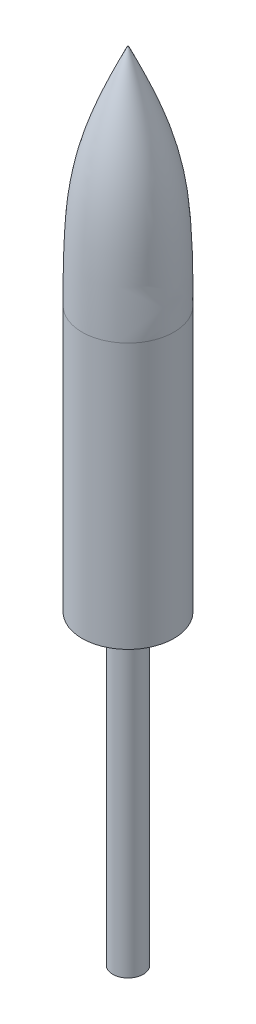
ISO-10303-21;
HEADER;
FILE_DESCRIPTION(('STEP AP214'),'2;1');
FILE_NAME('part.step','',(''),(''),'','','');
FILE_SCHEMA(('AUTOMOTIVE_DESIGN { 1 0 10303 214 1 1 1 1 }'));
ENDSEC;
DATA;
#1=APPLICATION_CONTEXT('core data for automotive mechanical design processes');
#2=APPLICATION_PROTOCOL_DEFINITION('international standard','automotive_design',2000,#1);
#3=PRODUCT_CONTEXT('',#1,'mechanical');
#4=PRODUCT('Part','Part','',(#3));
#5=PRODUCT_RELATED_PRODUCT_CATEGORY('part','',(#4));
#6=PRODUCT_DEFINITION_FORMATION('','',#4);
#7=PRODUCT_DEFINITION_CONTEXT('part definition',#1,'design');
#8=PRODUCT_DEFINITION('design','',#6,#7);
#9=PRODUCT_DEFINITION_SHAPE('','',#8);
#10=(LENGTH_UNIT() NAMED_UNIT(*) SI_UNIT(.MILLI.,.METRE.));
#11=(NAMED_UNIT(*) PLANE_ANGLE_UNIT() SI_UNIT($,.RADIAN.));
#12=(NAMED_UNIT(*) SI_UNIT($,.STERADIAN.) SOLID_ANGLE_UNIT());
#13=UNCERTAINTY_MEASURE_WITH_UNIT(LENGTH_MEASURE(1.E-05),#10,'distance_accuracy_value','');
#14=(GEOMETRIC_REPRESENTATION_CONTEXT(3) GLOBAL_UNCERTAINTY_ASSIGNED_CONTEXT((#13)) GLOBAL_UNIT_ASSIGNED_CONTEXT((#10,
#11,#12)) REPRESENTATION_CONTEXT('',''));
#15=CARTESIAN_POINT('',(0.,0.,0.));
#16=DIRECTION('',(0.,0.,1.));
#17=DIRECTION('',(1.,0.,0.));
#18=AXIS2_PLACEMENT_3D('',#15,#16,#17);
#19=CARTESIAN_POINT('',(0.,0.,0.));
#20=DIRECTION('',(0.,1.,0.));
#21=DIRECTION('',(0.,0.,1.));
#22=AXIS2_PLACEMENT_3D('',#19,#20,#21);
#23=PLANE('',#22);
#24=CARTESIAN_POINT('',(0.,0.,0.));
#25=DIRECTION('',(0.,1.,0.));
#26=DIRECTION('',(0.,0.,1.));
#27=AXIS2_PLACEMENT_3D('',#24,#25,#26);
#28=CIRCLE('',#27,1.);
#29=CARTESIAN_POINT('',(0.,0.,1.));
#30=VERTEX_POINT('',#29);
#31=EDGE_CURVE('E11',#30,#30,#28,.F.);
#32=ORIENTED_EDGE('',*,*,#31,.F.);
#33=EDGE_LOOP('',(#32));
#34=FACE_BOUND('',#33,.T.);
#35=CARTESIAN_POINT('',(0.,0.,0.));
#36=DIRECTION('',(0.,1.,0.));
#37=DIRECTION('',(0.,0.,1.));
#38=AXIS2_PLACEMENT_3D('',#35,#36,#37);
#39=CIRCLE('',#38,3.);
#40=CARTESIAN_POINT('',(0.,0.,3.));
#41=VERTEX_POINT('',#40);
#42=EDGE_CURVE('E38',#41,#41,#39,.T.);
#43=ORIENTED_EDGE('',*,*,#42,.F.);
#44=EDGE_LOOP('',(#43));
#45=FACE_BOUND('',#44,.T.);
#46=ADVANCED_FACE('F32',(#34,#45),#23,.F.);
#47=CARTESIAN_POINT('',(0.,44.7359619675995,0.));
#48=DIRECTION('',(0.,1.,0.));
#49=DIRECTION('',(0.,0.,1.));
#50=AXIS2_PLACEMENT_3D('',#47,#48,#49);
#51=CYLINDRICAL_SURFACE('',#50,3.);
#52=CARTESIAN_POINT('',(0.,17.3270985781828,0.));
#53=DIRECTION('',(0.,1.,0.));
#54=DIRECTION('',(0.,0.,1.));
#55=AXIS2_PLACEMENT_3D('',#52,#53,#54);
#56=CIRCLE('',#55,3.);
#57=CARTESIAN_POINT('',(0.,17.3270985781828,3.));
#58=VERTEX_POINT('',#57);
#59=EDGE_CURVE('E51',#58,#58,#56,.T.);
#60=ORIENTED_EDGE('',*,*,#59,.F.);
#61=EDGE_LOOP('',(#60));
#62=FACE_BOUND('',#61,.T.);
#63=ORIENTED_EDGE('',*,*,#42,.T.);
#64=EDGE_LOOP('',(#63));
#65=FACE_BOUND('',#64,.T.);
#66=ADVANCED_FACE('F66',(#62,#65),#51,.T.);
#67=CARTESIAN_POINT('',(3.,17.3270985781828,0.));
#68=CARTESIAN_POINT('',(3.,24.0510776851791,0.));
#69=CARTESIAN_POINT('',(2.79427120454836,26.0504577088531,0.));
#70=CARTESIAN_POINT('',(0.0375031813691091,31.9869495560917,0.));
#71=B_SPLINE_CURVE_WITH_KNOTS('',3,(#67,#68,#69,#70),.UNSPECIFIED.,.F.,.F.,(4,4),(0.,1.),.UNSPECIFIED.);
#72=CARTESIAN_POINT('',(0.,44.7359619675995,0.));
#73=DIRECTION('',(0.,1.,0.));
#74=AXIS1_PLACEMENT('',#72,#73);
#75=SURFACE_OF_REVOLUTION('',#71,#74);
#76=CARTESIAN_POINT('',(0.,31.9869495560917,0.));
#77=DIRECTION('',(0.,1.,0.));
#78=DIRECTION('',(0.,0.,1.));
#79=AXIS2_PLACEMENT_3D('',#76,#77,#78);
#80=CIRCLE('',#79,0.0375031813691091);
#81=CARTESIAN_POINT('',(0.,31.9869495560917,0.0375031813691091));
#82=VERTEX_POINT('',#81);
#83=EDGE_CURVE('E49',#82,#82,#80,.T.);
#84=ORIENTED_EDGE('',*,*,#83,.F.);
#85=EDGE_LOOP('',(#84));
#86=FACE_BOUND('',#85,.T.);
#87=ORIENTED_EDGE('',*,*,#59,.T.);
#88=EDGE_LOOP('',(#87));
#89=FACE_BOUND('',#88,.T.);
#90=ADVANCED_FACE('F45',(#86,#89),#75,.T.);
#91=CARTESIAN_POINT('',(0.0375031813691091,31.9869495560917,0.));
#92=CARTESIAN_POINT('',(0.0206171445469432,31.9999296779946,0.));
#93=CARTESIAN_POINT('',(0.,32.,0.));
#94=B_SPLINE_CURVE_WITH_KNOTS('',2,(#91,#92,#93),.UNSPECIFIED.,.F.,.F.,(3,3),(0.,1.),.UNSPECIFIED.);
#95=CARTESIAN_POINT('',(0.,44.7359619675995,0.));
#96=DIRECTION('',(0.,1.,0.));
#97=AXIS1_PLACEMENT('',#95,#96);
#98=SURFACE_OF_REVOLUTION('',#94,#97);
#99=CARTESIAN_POINT('',(0.,32.,0.));
#100=VERTEX_POINT('',#99);
#101=VERTEX_LOOP('',#100);
#102=FACE_BOUND('',#101,.T.);
#103=ORIENTED_EDGE('',*,*,#83,.T.);
#104=EDGE_LOOP('',(#103));
#105=FACE_BOUND('',#104,.T.);
#106=ADVANCED_FACE('F41',(#102,#105),#98,.T.);
#107=CARTESIAN_POINT('',(0.,-20.,0.));
#108=DIRECTION('',(0.,1.,0.));
#109=DIRECTION('',(0.,0.,1.));
#110=AXIS2_PLACEMENT_3D('',#107,#108,#109);
#111=CYLINDRICAL_SURFACE('',#110,1.);
#112=CARTESIAN_POINT('',(0.,-20.,0.));
#113=DIRECTION('',(0.,-1.,0.));
#114=DIRECTION('',(0.,0.,-1.));
#115=AXIS2_PLACEMENT_3D('',#112,#113,#114);
#116=CIRCLE('',#115,1.);
#117=CARTESIAN_POINT('',(0.,-20.,-1.));
#118=VERTEX_POINT('',#117);
#119=EDGE_CURVE('E52',#118,#118,#116,.T.);
#120=ORIENTED_EDGE('',*,*,#119,.F.);
#121=EDGE_LOOP('',(#120));
#122=FACE_BOUND('',#121,.T.);
#123=ORIENTED_EDGE('',*,*,#31,.T.);
#124=EDGE_LOOP('',(#123));
#125=FACE_BOUND('',#124,.T.);
#126=ADVANCED_FACE('F44',(#122,#125),#111,.T.);
#127=CARTESIAN_POINT('',(0.,-20.,0.));
#128=DIRECTION('',(0.,-1.,0.));
#129=DIRECTION('',(0.,0.,-1.));
#130=AXIS2_PLACEMENT_3D('',#127,#128,#129);
#131=PLANE('',#130);
#132=ORIENTED_EDGE('',*,*,#119,.T.);
#133=EDGE_LOOP('',(#132));
#134=FACE_BOUND('',#133,.T.);
#135=ADVANCED_FACE('F77',(#134),#131,.T.);
#136=CLOSED_SHELL('',(#46,#66,#90,#106,#126,#135));
#137=MANIFOLD_SOLID_BREP('B2',#136);
#138=ADVANCED_BREP_SHAPE_REPRESENTATION('',(#18,#137),#14);
#139=SHAPE_DEFINITION_REPRESENTATION(#9,#138);
ENDSEC;
END-ISO-10303-21;
